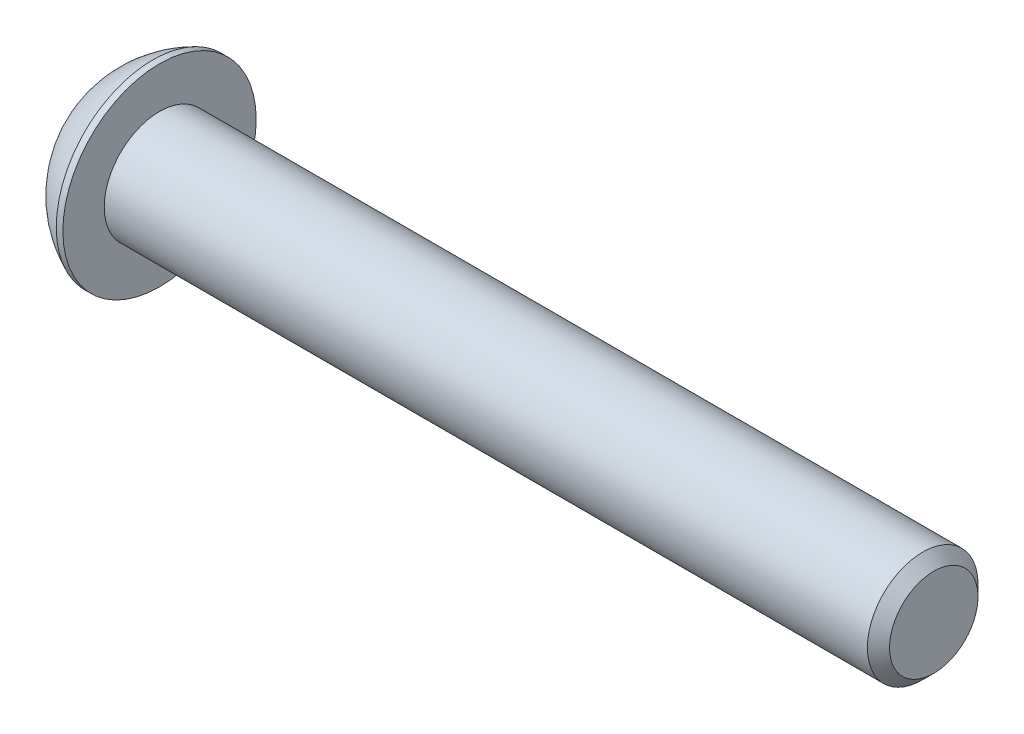
ISO-10303-21;
HEADER;
FILE_DESCRIPTION(('STEP AP214'),'2;1');
FILE_NAME('part.step','',(''),(''),'','','');
FILE_SCHEMA(('AUTOMOTIVE_DESIGN { 1 0 10303 214 1 1 1 1 }'));
ENDSEC;
DATA;
#1=APPLICATION_CONTEXT('core data for automotive mechanical design processes');
#2=APPLICATION_PROTOCOL_DEFINITION('international standard','automotive_design',2000,#1);
#3=PRODUCT_CONTEXT('',#1,'mechanical');
#4=PRODUCT('Part','Part','',(#3));
#5=PRODUCT_RELATED_PRODUCT_CATEGORY('part','',(#4));
#6=PRODUCT_DEFINITION_FORMATION('','',#4);
#7=PRODUCT_DEFINITION_CONTEXT('part definition',#1,'design');
#8=PRODUCT_DEFINITION('design','',#6,#7);
#9=PRODUCT_DEFINITION_SHAPE('','',#8);
#10=(LENGTH_UNIT() NAMED_UNIT(*) SI_UNIT(.MILLI.,.METRE.));
#11=(NAMED_UNIT(*) PLANE_ANGLE_UNIT() SI_UNIT($,.RADIAN.));
#12=(NAMED_UNIT(*) SI_UNIT($,.STERADIAN.) SOLID_ANGLE_UNIT());
#13=UNCERTAINTY_MEASURE_WITH_UNIT(LENGTH_MEASURE(1.E-05),#10,'distance_accuracy_value','');
#14=(GEOMETRIC_REPRESENTATION_CONTEXT(3) GLOBAL_UNCERTAINTY_ASSIGNED_CONTEXT((#13)) GLOBAL_UNIT_ASSIGNED_CONTEXT((#10,
#11,#12)) REPRESENTATION_CONTEXT('',''));
#15=CARTESIAN_POINT('',(0.,0.,0.));
#16=DIRECTION('',(0.,0.,1.));
#17=DIRECTION('',(1.,0.,0.));
#18=AXIS2_PLACEMENT_3D('',#15,#16,#17);
#19=CARTESIAN_POINT('',(1.32080000000034,0.,0.));
#20=DIRECTION('',(-1.,0.,0.));
#21=DIRECTION('',(0.,0.,1.));
#22=AXIS2_PLACEMENT_3D('',#19,#20,#21);
#23=CONICAL_SURFACE('',#22,1.1937999999998,1.04719755119608);
#24=CARTESIAN_POINT('',(2.01004075135902,0.,-4.44089209850063E-13));
#25=VERTEX_POINT('',#24);
#26=VERTEX_LOOP('',#25);
#27=FACE_BOUND('',#26,.T.);
#28=CARTESIAN_POINT('',(1.32080000000009,0.,0.));
#29=DIRECTION('',(-1.,0.,0.));
#30=DIRECTION('',(0.,0.,1.));
#31=AXIS2_PLACEMENT_3D('',#28,#29,#30);
#32=CIRCLE('',#31,1.19380000000024);
#33=CARTESIAN_POINT('',(1.32080000000009,0.,1.19380000000024));
#34=VERTEX_POINT('',#33);
#35=EDGE_CURVE('E19',#34,#34,#32,.T.);
#36=ORIENTED_EDGE('',*,*,#35,.T.);
#37=EDGE_LOOP('',(#36));
#38=FACE_BOUND('',#37,.T.);
#39=ADVANCED_FACE('F16',(#27,#38),#23,.F.);
#40=CARTESIAN_POINT('',(1.3208,-2.28769270663697,0.));
#41=DIRECTION('',(1.,0.,0.));
#42=DIRECTION('',(0.,0.,-1.));
#43=AXIS2_PLACEMENT_3D('',#40,#41,#42);
#44=PLANE('',#43);
#45=DIRECTION('',(0.,1.,0.));
#46=VECTOR('',#45,1.);
#47=CARTESIAN_POINT('',(1.3208,-1.14384635331849,1.9812));
#48=LINE('',#47,#46);
#49=CARTESIAN_POINT('',(1.3208,1.14384635331849,1.9812));
#50=VERTEX_POINT('',#49);
#51=CARTESIAN_POINT('',(1.3208,-1.14384635331849,1.9812));
#52=VERTEX_POINT('',#51);
#53=EDGE_CURVE('E68',#50,#52,#48,.F.);
#54=ORIENTED_EDGE('',*,*,#53,.F.);
#55=DIRECTION('',(0.,0.5,-0.866025403784439));
#56=VECTOR('',#55,1.);
#57=CARTESIAN_POINT('',(1.3208,1.14384635331849,1.9812));
#58=LINE('',#57,#56);
#59=CARTESIAN_POINT('',(1.3208,2.28769270663697,0.));
#60=VERTEX_POINT('',#59);
#61=EDGE_CURVE('E292',#60,#50,#58,.F.);
#62=ORIENTED_EDGE('',*,*,#61,.F.);
#63=DIRECTION('',(0.,-0.5,-0.866025403784439));
#64=VECTOR('',#63,1.);
#65=CARTESIAN_POINT('',(1.3208,2.28769270663697,0.));
#66=LINE('',#65,#64);
#67=CARTESIAN_POINT('',(1.3208,1.14384635331849,-1.9812));
#68=VERTEX_POINT('',#67);
#69=EDGE_CURVE('E296',#68,#60,#66,.F.);
#70=ORIENTED_EDGE('',*,*,#69,.F.);
#71=DIRECTION('',(0.,1.,0.));
#72=VECTOR('',#71,1.);
#73=CARTESIAN_POINT('',(1.3208,1.14384635331849,-1.9812));
#74=LINE('',#73,#72);
#75=CARTESIAN_POINT('',(1.3208,-1.14384635331849,-1.9812));
#76=VERTEX_POINT('',#75);
#77=EDGE_CURVE('E301',#76,#68,#74,.T.);
#78=ORIENTED_EDGE('',*,*,#77,.F.);
#79=DIRECTION('',(0.,-0.5,0.866025403784438));
#80=VECTOR('',#79,1.);
#81=CARTESIAN_POINT('',(1.3208,-1.14384635331849,-1.9812));
#82=LINE('',#81,#80);
#83=CARTESIAN_POINT('',(1.3208,-2.28769270663697,0.));
#84=VERTEX_POINT('',#83);
#85=EDGE_CURVE('E306',#84,#76,#82,.F.);
#86=ORIENTED_EDGE('',*,*,#85,.F.);
#87=DIRECTION('',(0.,0.500000000000001,0.866025403784438));
#88=VECTOR('',#87,1.);
#89=CARTESIAN_POINT('',(1.3208,-2.28769270663697,0.));
#90=LINE('',#89,#88);
#91=EDGE_CURVE('E81',#52,#84,#90,.F.);
#92=ORIENTED_EDGE('',*,*,#91,.F.);
#93=EDGE_LOOP('',(#54,#62,#70,#78,#86,#92));
#94=FACE_BOUND('',#93,.T.);
#95=ORIENTED_EDGE('',*,*,#35,.F.);
#96=EDGE_LOOP('',(#95));
#97=FACE_BOUND('',#96,.T.);
#98=ADVANCED_FACE('F74',(#94,#97),#44,.F.);
#99=CARTESIAN_POINT('',(1.3208,-1.14384635331849,1.9812));
#100=DIRECTION('',(0.,0.,-1.));
#101=DIRECTION('',(-1.,0.,0.));
#102=AXIS2_PLACEMENT_3D('',#99,#100,#101);
#103=PLANE('',#102);
#104=ORIENTED_EDGE('',*,*,#53,.T.);
#105=DIRECTION('',(1.,0.,0.));
#106=VECTOR('',#105,1.);
#107=CARTESIAN_POINT('',(1.3208,-1.14384635331849,1.9812));
#108=LINE('',#107,#106);
#109=CARTESIAN_POINT('',(0.,-1.14384635331849,1.9812));
#110=VERTEX_POINT('',#109);
#111=EDGE_CURVE('E78',#110,#52,#108,.T.);
#112=ORIENTED_EDGE('',*,*,#111,.F.);
#113=DIRECTION('',(0.,1.,0.));
#114=VECTOR('',#113,1.);
#115=CARTESIAN_POINT('',(0.,0.,1.9812));
#116=LINE('',#115,#114);
#117=CARTESIAN_POINT('',(0.,1.14384635331849,1.9812));
#118=VERTEX_POINT('',#117);
#119=EDGE_CURVE('E286',#118,#110,#116,.F.);
#120=ORIENTED_EDGE('',*,*,#119,.F.);
#121=DIRECTION('',(1.,0.,0.));
#122=VECTOR('',#121,1.);
#123=CARTESIAN_POINT('',(1.3208,1.14384635331849,1.9812));
#124=LINE('',#123,#122);
#125=EDGE_CURVE('E289',#50,#118,#124,.F.);
#126=ORIENTED_EDGE('',*,*,#125,.F.);
#127=EDGE_LOOP('',(#104,#112,#120,#126));
#128=FACE_BOUND('',#127,.T.);
#129=ADVANCED_FACE('F128',(#128),#103,.T.);
#130=CARTESIAN_POINT('',(1.3208,-2.28769270663697,0.));
#131=DIRECTION('',(0.,0.866025403784438,-0.500000000000001));
#132=DIRECTION('',(0.,0.500000000000001,0.866025403784438));
#133=AXIS2_PLACEMENT_3D('',#130,#131,#132);
#134=PLANE('',#133);
#135=ORIENTED_EDGE('',*,*,#91,.T.);
#136=DIRECTION('',(1.,0.,0.));
#137=VECTOR('',#136,1.);
#138=CARTESIAN_POINT('',(1.3208,-2.28769270663697,0.));
#139=LINE('',#138,#137);
#140=CARTESIAN_POINT('',(0.,-2.28769270663697,0.));
#141=VERTEX_POINT('',#140);
#142=EDGE_CURVE('E308',#141,#84,#139,.T.);
#143=ORIENTED_EDGE('',*,*,#142,.F.);
#144=DIRECTION('',(0.,-0.500000000000001,-0.866025403784438));
#145=VECTOR('',#144,1.);
#146=CARTESIAN_POINT('',(0.,-1.14384635331849,1.9812));
#147=LINE('',#146,#145);
#148=EDGE_CURVE('E283',#110,#141,#147,.T.);
#149=ORIENTED_EDGE('',*,*,#148,.F.);
#150=ORIENTED_EDGE('',*,*,#111,.T.);
#151=EDGE_LOOP('',(#135,#143,#149,#150));
#152=FACE_BOUND('',#151,.T.);
#153=ADVANCED_FACE('F124',(#152),#134,.T.);
#154=CARTESIAN_POINT('',(1.3208,-1.14384635331849,-1.9812));
#155=DIRECTION('',(0.,0.866025403784438,0.5));
#156=DIRECTION('',(0.,-0.5,0.866025403784438));
#157=AXIS2_PLACEMENT_3D('',#154,#155,#156);
#158=PLANE('',#157);
#159=ORIENTED_EDGE('',*,*,#85,.T.);
#160=DIRECTION('',(1.,0.,0.));
#161=VECTOR('',#160,1.);
#162=CARTESIAN_POINT('',(1.3208,-1.14384635331849,-1.9812));
#163=LINE('',#162,#161);
#164=CARTESIAN_POINT('',(0.,-1.14384635331849,-1.9812));
#165=VERTEX_POINT('',#164);
#166=EDGE_CURVE('E303',#165,#76,#163,.T.);
#167=ORIENTED_EDGE('',*,*,#166,.F.);
#168=DIRECTION('',(0.,0.5,-0.866025403784438));
#169=VECTOR('',#168,1.);
#170=CARTESIAN_POINT('',(0.,-2.28769270663697,0.));
#171=LINE('',#170,#169);
#172=EDGE_CURVE('E280',#141,#165,#171,.T.);
#173=ORIENTED_EDGE('',*,*,#172,.F.);
#174=ORIENTED_EDGE('',*,*,#142,.T.);
#175=EDGE_LOOP('',(#159,#167,#173,#174));
#176=FACE_BOUND('',#175,.T.);
#177=ADVANCED_FACE('F120',(#176),#158,.T.);
#178=CARTESIAN_POINT('',(1.3208,1.14384635331849,-1.9812));
#179=DIRECTION('',(0.,0.,1.));
#180=DIRECTION('',(1.,0.,0.));
#181=AXIS2_PLACEMENT_3D('',#178,#179,#180);
#182=PLANE('',#181);
#183=ORIENTED_EDGE('',*,*,#77,.T.);
#184=DIRECTION('',(1.,0.,0.));
#185=VECTOR('',#184,1.);
#186=CARTESIAN_POINT('',(1.3208,1.14384635331849,-1.9812));
#187=LINE('',#186,#185);
#188=CARTESIAN_POINT('',(0.,1.14384635331849,-1.9812));
#189=VERTEX_POINT('',#188);
#190=EDGE_CURVE('E298',#189,#68,#187,.T.);
#191=ORIENTED_EDGE('',*,*,#190,.F.);
#192=DIRECTION('',(0.,1.,0.));
#193=VECTOR('',#192,1.);
#194=CARTESIAN_POINT('',(0.,0.,-1.9812));
#195=LINE('',#194,#193);
#196=EDGE_CURVE('E277',#165,#189,#195,.T.);
#197=ORIENTED_EDGE('',*,*,#196,.F.);
#198=ORIENTED_EDGE('',*,*,#166,.T.);
#199=EDGE_LOOP('',(#183,#191,#197,#198));
#200=FACE_BOUND('',#199,.T.);
#201=ADVANCED_FACE('F117',(#200),#182,.T.);
#202=CARTESIAN_POINT('',(1.3208,2.28769270663697,0.));
#203=DIRECTION('',(0.,-0.866025403784439,0.5));
#204=DIRECTION('',(0.,-0.5,-0.866025403784439));
#205=AXIS2_PLACEMENT_3D('',#202,#203,#204);
#206=PLANE('',#205);
#207=ORIENTED_EDGE('',*,*,#69,.T.);
#208=DIRECTION('',(1.,0.,0.));
#209=VECTOR('',#208,1.);
#210=CARTESIAN_POINT('',(1.3208,2.28769270663697,0.));
#211=LINE('',#210,#209);
#212=CARTESIAN_POINT('',(0.,2.28769270663697,0.));
#213=VERTEX_POINT('',#212);
#214=EDGE_CURVE('E34',#213,#60,#211,.T.);
#215=ORIENTED_EDGE('',*,*,#214,.F.);
#216=DIRECTION('',(0.,0.5,0.866025403784439));
#217=VECTOR('',#216,1.);
#218=CARTESIAN_POINT('',(0.,1.14384635331849,-1.9812));
#219=LINE('',#218,#217);
#220=EDGE_CURVE('E274',#189,#213,#219,.T.);
#221=ORIENTED_EDGE('',*,*,#220,.F.);
#222=ORIENTED_EDGE('',*,*,#190,.T.);
#223=EDGE_LOOP('',(#207,#215,#221,#222));
#224=FACE_BOUND('',#223,.T.);
#225=ADVANCED_FACE('F113',(#224),#206,.T.);
#226=CARTESIAN_POINT('',(1.3208,1.14384635331849,1.9812));
#227=DIRECTION('',(0.,-0.866025403784439,-0.5));
#228=DIRECTION('',(0.,0.5,-0.866025403784439));
#229=AXIS2_PLACEMENT_3D('',#226,#227,#228);
#230=PLANE('',#229);
#231=ORIENTED_EDGE('',*,*,#61,.T.);
#232=ORIENTED_EDGE('',*,*,#125,.T.);
#233=DIRECTION('',(0.,-0.5,0.866025403784439));
#234=VECTOR('',#233,1.);
#235=CARTESIAN_POINT('',(0.,2.28769270663697,0.));
#236=LINE('',#235,#234);
#237=EDGE_CURVE('E100',#213,#118,#236,.T.);
#238=ORIENTED_EDGE('',*,*,#237,.F.);
#239=ORIENTED_EDGE('',*,*,#214,.T.);
#240=EDGE_LOOP('',(#231,#232,#238,#239));
#241=FACE_BOUND('',#240,.T.);
#242=ADVANCED_FACE('F109',(#241),#230,.T.);
#243=CARTESIAN_POINT('',(0.,0.,0.));
#244=DIRECTION('',(-1.,0.,0.));
#245=DIRECTION('',(0.,0.,1.));
#246=AXIS2_PLACEMENT_3D('',#243,#244,#245);
#247=PLANE('',#246);
#248=ORIENTED_EDGE('',*,*,#220,.T.);
#249=ORIENTED_EDGE('',*,*,#237,.T.);
#250=ORIENTED_EDGE('',*,*,#119,.T.);
#251=ORIENTED_EDGE('',*,*,#148,.T.);
#252=ORIENTED_EDGE('',*,*,#172,.T.);
#253=ORIENTED_EDGE('',*,*,#196,.T.);
#254=EDGE_LOOP('',(#248,#249,#250,#251,#252,#253));
#255=FACE_BOUND('',#254,.T.);
#256=CARTESIAN_POINT('',(0.,2.77495,0.));
#257=CARTESIAN_POINT('',(0.,2.77494953309947,0.0779118937523458));
#258=CARTESIAN_POINT('',(0.,2.77166578388025,0.15583810591977));
#259=CARTESIAN_POINT('',(0.,2.75855213600204,0.311152012455904));
#260=CARTESIAN_POINT('',(0.,2.74872030471467,0.388539541019556));
#261=CARTESIAN_POINT('',(0.,2.72255472645676,0.542341518735717));
#262=CARTESIAN_POINT('',(-2.70414110576258E-13,2.70621065843662,0.618754223567578));
#263=CARTESIAN_POINT('',(2.71501725221868E-13,2.66713326915777,0.769973634286023));
#264=CARTESIAN_POINT('',(1.01274952524446E-12,2.64439476297869,0.844778983646282));
#265=CARTESIAN_POINT('',(1.81909959813207E-12,2.5669019594335,1.06566239301792));
#266=CARTESIAN_POINT('',(4.77081687541822E-13,2.50280672569928,1.20857954243987));
#267=CARTESIAN_POINT('',(-4.76232447128611E-13,2.35149826934097,1.48160874561538));
#268=CARTESIAN_POINT('',(0.,2.26428416790396,1.61172031233499));
#269=CARTESIAN_POINT('',(0.,2.1181093928834,1.79445660654268));
#270=CARTESIAN_POINT('',(0.,2.06678693791626,1.85333128513997));
#271=CARTESIAN_POINT('',(0.,1.95940522984449,1.96650727912792));
#272=CARTESIAN_POINT('',(0.,1.90335059143535,2.02081294920044));
#273=CARTESIAN_POINT('',(0.,1.78683891013963,2.12453280878582));
#274=CARTESIAN_POINT('',(0.,1.72637988450322,2.1739447713554));
#275=CARTESIAN_POINT('',(0.,1.60151968865711,2.26750481692908));
#276=CARTESIAN_POINT('',(0.,1.53711760864537,2.31165167810847));
#277=CARTESIAN_POINT('',(0.,1.33869902291632,2.43567242603944));
#278=CARTESIAN_POINT('',(0.,1.19934704110695,2.507235886628));
#279=CARTESIAN_POINT('',(0.,0.91068160912188,2.62590828672821));
#280=CARTESIAN_POINT('',(0.,0.761368265357397,2.67301748742278));
#281=CARTESIAN_POINT('',(0.,0.456932649466622,2.74151230664007));
#282=CARTESIAN_POINT('',(0.,0.301810346322583,2.76289778778721));
#283=CARTESIAN_POINT('',(0.,-0.0098226387089525,2.77931595661156));
#284=CARTESIAN_POINT('',(0.,-0.166333320596449,2.77434864428877));
#285=CARTESIAN_POINT('',(0.,-0.476280836814453,2.73822217653073));
#286=CARTESIAN_POINT('',(0.,-0.629717687555987,2.70706316096981));
#287=CARTESIAN_POINT('',(0.,-0.929254830044276,2.61937980771149));
#288=CARTESIAN_POINT('',(0.,-1.0753550434132,2.56285519909568));
#289=CARTESIAN_POINT('',(0.,-1.28570692598579,2.46037024128109));
#290=CARTESIAN_POINT('',(0.,-1.35439130022287,2.42323494812896));
#291=CARTESIAN_POINT('',(0.,-1.488391287199,2.34331277270256));
#292=CARTESIAN_POINT('',(0.,-1.55370767631787,2.30052720108831));
#293=CARTESIAN_POINT('',(0.,-1.68047292776594,2.20962421887055));
#294=CARTESIAN_POINT('',(0.,-1.7419235278682,2.16150923122348));
#295=CARTESIAN_POINT('',(0.,-1.86060297067992,2.06024311301283));
#296=CARTESIAN_POINT('',(0.,-1.91782768181715,2.0070871669763));
#297=CARTESIAN_POINT('',(0.,-2.08239462196651,1.8407220856554));
#298=CARTESIAN_POINT('',(0.,-2.18279764272601,1.72049499758422));
#299=CARTESIAN_POINT('',(0.,-2.36195754944064,1.46487629213018));
#300=CARTESIAN_POINT('',(0.,-2.44071525816758,1.32948525142807));
#301=CARTESIAN_POINT('',(0.,-2.54098882695274,1.11796734074395));
#302=CARTESIAN_POINT('',(0.,-2.57146177392727,1.04596540008347));
#303=CARTESIAN_POINT('',(0.,-2.62621251108999,0.899689259475765));
#304=CARTESIAN_POINT('',(0.,-2.65049531495563,0.825416953360953));
#305=CARTESIAN_POINT('',(0.,-2.69267708798766,0.675215808695207));
#306=CARTESIAN_POINT('',(0.,-2.71058613777937,0.599289789313091));
#307=CARTESIAN_POINT('',(0.,-2.73994710360127,0.446213628496931));
#308=CARTESIAN_POINT('',(0.,-2.75140092413871,0.369063855024788));
#309=CARTESIAN_POINT('',(0.,-2.76470470685522,0.24316208817343));
#310=CARTESIAN_POINT('',(0.,-2.76854547596618,0.194611672428576));
#311=CARTESIAN_POINT('',(0.,-2.77366826843264,0.0973760351839811));
#312=CARTESIAN_POINT('',(0.,-2.77495029178814,0.0486908136842395));
#313=CARTESIAN_POINT('',(0.,-2.77494953309947,-0.0779118937523474));
#314=CARTESIAN_POINT('',(0.,-2.77166578388025,-0.155838105919772));
#315=CARTESIAN_POINT('',(0.,-2.75855213600204,-0.311152012455906));
#316=CARTESIAN_POINT('',(0.,-2.74872030471467,-0.388539541019558));
#317=CARTESIAN_POINT('',(0.,-2.72255472645677,-0.542341518735719));
#318=CARTESIAN_POINT('',(-2.70149297926331E-13,-2.70621065843663,-0.61875422356758));
#319=CARTESIAN_POINT('',(2.712366972268E-13,-2.66713326915777,-0.769973634286025));
#320=CARTESIAN_POINT('',(1.01141467738461E-12,-2.64439476297869,-0.844778983646283));
#321=CARTESIAN_POINT('',(1.81656702958366E-12,-2.5669019594335,-1.06566239301792));
#322=CARTESIAN_POINT('',(4.7641829195856E-13,-2.50280672569928,-1.20857954243988));
#323=CARTESIAN_POINT('',(-4.75569026324207E-13,-2.35149826934097,-1.48160874561538));
#324=CARTESIAN_POINT('',(0.,-2.26428416790396,-1.61172031233499));
#325=CARTESIAN_POINT('',(0.,-2.1181093928834,-1.79445660654268));
#326=CARTESIAN_POINT('',(0.,-2.06678693791626,-1.85333128513996));
#327=CARTESIAN_POINT('',(0.,-1.95940522984449,-1.96650727912792));
#328=CARTESIAN_POINT('',(0.,-1.90335059143535,-2.02081294920045));
#329=CARTESIAN_POINT('',(0.,-1.78683891013963,-2.12453280878582));
#330=CARTESIAN_POINT('',(0.,-1.72637988450322,-2.1739447713554));
#331=CARTESIAN_POINT('',(0.,-1.60151968865711,-2.26750481692908));
#332=CARTESIAN_POINT('',(0.,-1.53711760864537,-2.31165167810847));
#333=CARTESIAN_POINT('',(0.,-1.33869902291632,-2.43567242603944));
#334=CARTESIAN_POINT('',(0.,-1.19934704110695,-2.507235886628));
#335=CARTESIAN_POINT('',(0.,-0.91068160912188,-2.62590828672821));
#336=CARTESIAN_POINT('',(0.,-0.761368265357397,-2.67301748742278));
#337=CARTESIAN_POINT('',(0.,-0.456932649466622,-2.74151230664007));
#338=CARTESIAN_POINT('',(0.,-0.301810346322583,-2.76289778778721));
#339=CARTESIAN_POINT('',(0.,0.00982263870895269,-2.77931595661156));
#340=CARTESIAN_POINT('',(0.,0.166333320596449,-2.77434864428876));
#341=CARTESIAN_POINT('',(0.,0.476280836814453,-2.73822217653073));
#342=CARTESIAN_POINT('',(0.,0.629717687555987,-2.70706316096981));
#343=CARTESIAN_POINT('',(0.,0.929254830044275,-2.6193798077115));
#344=CARTESIAN_POINT('',(0.,1.0753550434132,-2.56285519909568));
#345=CARTESIAN_POINT('',(0.,1.28570692598579,-2.46037024128109));
#346=CARTESIAN_POINT('',(0.,1.35439130022286,-2.42323494812896));
#347=CARTESIAN_POINT('',(0.,1.488391287199,-2.34331277270256));
#348=CARTESIAN_POINT('',(0.,1.55370767631787,-2.30052720108831));
#349=CARTESIAN_POINT('',(0.,1.68047292776594,-2.20962421887055));
#350=CARTESIAN_POINT('',(0.,1.7419235278682,-2.16150923122348));
#351=CARTESIAN_POINT('',(0.,1.86060297067992,-2.06024311301283));
#352=CARTESIAN_POINT('',(0.,1.91782768181715,-2.0070871669763));
#353=CARTESIAN_POINT('',(0.,2.08239462196651,-1.8407220856554));
#354=CARTESIAN_POINT('',(0.,2.18279764272601,-1.72049499758422));
#355=CARTESIAN_POINT('',(0.,2.36195754944063,-1.46487629213018));
#356=CARTESIAN_POINT('',(0.,2.44071525816757,-1.32948525142807));
#357=CARTESIAN_POINT('',(0.,2.54098882695274,-1.11796734074395));
#358=CARTESIAN_POINT('',(0.,2.57146177392727,-1.04596540008347));
#359=CARTESIAN_POINT('',(0.,2.62621251108999,-0.899689259475766));
#360=CARTESIAN_POINT('',(0.,2.65049531495563,-0.825416953360953));
#361=CARTESIAN_POINT('',(0.,2.69267708798766,-0.675215808695207));
#362=CARTESIAN_POINT('',(0.,2.71058613777936,-0.599289789313091));
#363=CARTESIAN_POINT('',(0.,2.73994710360127,-0.446213628496932));
#364=CARTESIAN_POINT('',(0.,2.75140092413871,-0.369063855024789));
#365=CARTESIAN_POINT('',(0.,2.76470470685522,-0.243162088173432));
#366=CARTESIAN_POINT('',(0.,2.76854547596618,-0.194611672428578));
#367=CARTESIAN_POINT('',(0.,2.77366826843264,-0.0973760351839823));
#368=CARTESIAN_POINT('',(0.,2.77495029178814,-0.0486908136842408));
#369=CARTESIAN_POINT('',(0.,2.77495,0.));
#370=B_SPLINE_CURVE_WITH_KNOTS('',3,(#256,#257,#258,#259,#260,#261,#262,#263,#264,#265,#266,
#267,#268,#269,#270,#271,#272,#273,#274,#275,#276,#277,#278,#279,#280,#281,#282,#283,#284,#285,
#286,#287,#288,#289,#290,#291,#292,#293,#294,#295,#296,#297,#298,#299,#300,#301,#302,#303,#304,
#305,#306,#307,#308,#309,#310,#311,#312,#313,#314,#315,#316,#317,#318,#319,#320,#321,#322,#323,
#324,#325,#326,#327,#328,#329,#330,#331,#332,#333,#334,#335,#336,#337,#338,#339,#340,#341,#342,
#343,#344,#345,#346,#347,#348,#349,#350,#351,#352,#353,#354,#355,#356,#357,#358,#359,#360,#361,
#362,#363,#364,#365,#366,#367,#368,#369),.UNSPECIFIED.,.T.,.F.,(4,2,2,2,2,2,2,2,2,2,2,2,2,2,2,2,
2,2,2,2,2,2,2,2,2,2,2,2,2,2,2,2,2,2,2,2,2,2,2,2,2,2,2,2,2,2,2,2,2,2,2,2,2,2,2,2,4),(0.,
0.233690856748162,0.467450716578751,0.701582538521471,0.935904756015414,1.40343220467667,
1.87097742791502,2.10505636898837,2.33890962270652,2.57286880998746,2.80688218486306,
3.27442101763127,3.74195485676357,4.20949119271389,4.67702752866417,5.14456136779641,
5.61210020056468,5.84611357544033,6.08007276272136,6.31392601643949,6.54800495751272,
7.01555018075071,7.48307762941212,7.71739984690652,7.95153166884955,8.18529152868022,
8.41898238542855,8.56502681353347,8.71107124163843,8.94476209838659,9.17852195821718,
9.4126537801599,9.64697599765384,10.1145034463151,10.5820486695534,10.8161276106268,
11.0499808643449,11.2839400516259,11.5179534265015,11.9854922592697,12.453026098402,
12.9205624343523,13.3880987703026,13.8556326094348,14.3231714422031,14.5571848170788,
14.7911440043598,15.0249972580779,15.2590761991512,15.7266214223891,16.1941488710506,
16.4284710885449,16.662602910488,16.8963627703186,17.130053627067,17.2760980551719,
17.4221424832769),.UNSPECIFIED.);
#371=CARTESIAN_POINT('',(0.,2.77495,0.));
#372=VERTEX_POINT('',#371);
#373=EDGE_CURVE('E93',#372,#372,#370,.T.);
#374=ORIENTED_EDGE('',*,*,#373,.F.);
#375=EDGE_LOOP('',(#374));
#376=FACE_BOUND('',#375,.T.);
#377=ADVANCED_FACE('F105',(#255,#376),#247,.T.);
#378=CARTESIAN_POINT('',(5.37260881410256,0.,0.));
#379=DIRECTION('',(0.,1.,0.));
#380=DIRECTION('',(1.,0.,0.));
#381=AXIS2_PLACEMENT_3D('',#378,#379,#380);
#382=SPHERICAL_SURFACE('',#381,6.04692260342999);
#383=CARTESIAN_POINT('',(2.9718,0.,0.));
#384=DIRECTION('',(-1.,0.,0.));
#385=DIRECTION('',(0.,0.,1.));
#386=AXIS2_PLACEMENT_3D('',#383,#384,#385);
#387=CIRCLE('',#386,5.5499);
#388=CARTESIAN_POINT('',(2.9718,0.,5.5499));
#389=VERTEX_POINT('',#388);
#390=EDGE_CURVE('E91',#389,#389,#387,.F.);
#391=ORIENTED_EDGE('',*,*,#390,.F.);
#392=EDGE_LOOP('',(#391));
#393=FACE_BOUND('',#392,.T.);
#394=ORIENTED_EDGE('',*,*,#373,.T.);
#395=EDGE_LOOP('',(#394));
#396=FACE_BOUND('',#395,.T.);
#397=ADVANCED_FACE('F101',(#393,#396),#382,.T.);
#398=CARTESIAN_POINT('',(47.8028,0.,0.));
#399=DIRECTION('',(-1.,0.,0.));
#400=DIRECTION('',(0.,0.,1.));
#401=AXIS2_PLACEMENT_3D('',#398,#399,#400);
#402=PLANE('',#401);
#403=CARTESIAN_POINT('',(47.8027999999426,0.,0.));
#404=DIRECTION('',(-1.,0.,0.));
#405=DIRECTION('',(0.,0.,1.));
#406=AXIS2_PLACEMENT_3D('',#403,#404,#405);
#407=CIRCLE('',#406,2.54000000006727);
#408=CARTESIAN_POINT('',(47.8027999999426,0.,2.54000000006727));
#409=VERTEX_POINT('',#408);
#410=EDGE_CURVE('E88',#409,#409,#407,.T.);
#411=ORIENTED_EDGE('',*,*,#410,.F.);
#412=EDGE_LOOP('',(#411));
#413=FACE_BOUND('',#412,.T.);
#414=ADVANCED_FACE('F155',(#413),#402,.F.);
#415=CARTESIAN_POINT('',(0.,0.,0.));
#416=DIRECTION('',(-1.,0.,0.));
#417=DIRECTION('',(0.,0.,1.));
#418=AXIS2_PLACEMENT_3D('',#415,#416,#417);
#419=CYLINDRICAL_SURFACE('',#418,5.5499);
#420=ORIENTED_EDGE('',*,*,#390,.T.);
#421=EDGE_LOOP('',(#420));
#422=FACE_BOUND('',#421,.T.);
#423=CARTESIAN_POINT('',(3.3528,0.,0.));
#424=DIRECTION('',(-1.,0.,0.));
#425=DIRECTION('',(0.,0.,1.));
#426=AXIS2_PLACEMENT_3D('',#423,#424,#425);
#427=CIRCLE('',#426,5.5499);
#428=CARTESIAN_POINT('',(3.3528,0.,5.5499));
#429=VERTEX_POINT('',#428);
#430=EDGE_CURVE('E85',#429,#429,#427,.T.);
#431=ORIENTED_EDGE('',*,*,#430,.T.);
#432=EDGE_LOOP('',(#431));
#433=FACE_BOUND('',#432,.T.);
#434=ADVANCED_FACE('F152',(#422,#433),#419,.T.);
#435=CARTESIAN_POINT('',(47.1678000000679,0.,0.));
#436=DIRECTION('',(-1.,0.,0.));
#437=DIRECTION('',(0.,0.,1.));
#438=AXIS2_PLACEMENT_3D('',#435,#436,#437);
#439=CONICAL_SURFACE('',#438,3.17499999988513,0.78539816335269);
#440=CARTESIAN_POINT('',(47.1678,0.,0.));
#441=DIRECTION('',(-1.,0.,0.));
#442=DIRECTION('',(0.,0.,1.));
#443=AXIS2_PLACEMENT_3D('',#440,#441,#442);
#444=CIRCLE('',#443,3.175);
#445=CARTESIAN_POINT('',(47.1678,0.,3.175));
#446=VERTEX_POINT('',#445);
#447=EDGE_CURVE('E25',#446,#446,#444,.T.);
#448=ORIENTED_EDGE('',*,*,#447,.F.);
#449=EDGE_LOOP('',(#448));
#450=FACE_BOUND('',#449,.T.);
#451=ORIENTED_EDGE('',*,*,#410,.T.);
#452=EDGE_LOOP('',(#451));
#453=FACE_BOUND('',#452,.T.);
#454=ADVANCED_FACE('F145',(#450,#453),#439,.T.);
#455=CARTESIAN_POINT('',(3.3528,3.175,0.));
#456=DIRECTION('',(-1.,0.,0.));
#457=DIRECTION('',(0.,0.,1.));
#458=AXIS2_PLACEMENT_3D('',#455,#456,#457);
#459=PLANE('',#458);
#460=CARTESIAN_POINT('',(3.3528,0.,0.));
#461=DIRECTION('',(-1.,0.,0.));
#462=DIRECTION('',(0.,0.,1.));
#463=AXIS2_PLACEMENT_3D('',#460,#461,#462);
#464=CIRCLE('',#463,3.175);
#465=CARTESIAN_POINT('',(3.3528,0.,3.175));
#466=VERTEX_POINT('',#465);
#467=EDGE_CURVE('E11',#466,#466,#464,.F.);
#468=ORIENTED_EDGE('',*,*,#467,.F.);
#469=EDGE_LOOP('',(#468));
#470=FACE_BOUND('',#469,.T.);
#471=ORIENTED_EDGE('',*,*,#430,.F.);
#472=EDGE_LOOP('',(#471));
#473=FACE_BOUND('',#472,.T.);
#474=ADVANCED_FACE('F139',(#470,#473),#459,.F.);
#475=CARTESIAN_POINT('',(0.,0.,0.));
#476=DIRECTION('',(-1.,0.,0.));
#477=DIRECTION('',(0.,0.,1.));
#478=AXIS2_PLACEMENT_3D('',#475,#476,#477);
#479=CYLINDRICAL_SURFACE('',#478,3.175);
#480=ORIENTED_EDGE('',*,*,#467,.T.);
#481=EDGE_LOOP('',(#480));
#482=FACE_BOUND('',#481,.T.);
#483=ORIENTED_EDGE('',*,*,#447,.T.);
#484=EDGE_LOOP('',(#483));
#485=FACE_BOUND('',#484,.T.);
#486=ADVANCED_FACE('F137',(#482,#485),#479,.T.);
#487=CLOSED_SHELL('',(#39,#98,#129,#153,#177,#201,#225,#242,#377,#397,#414,#434,#454,#474,#486));
#488=MANIFOLD_SOLID_BREP('B1',#487);
#489=ADVANCED_BREP_SHAPE_REPRESENTATION('',(#18,#488),#14);
#490=SHAPE_DEFINITION_REPRESENTATION(#9,#489);
ENDSEC;
END-ISO-10303-21;
